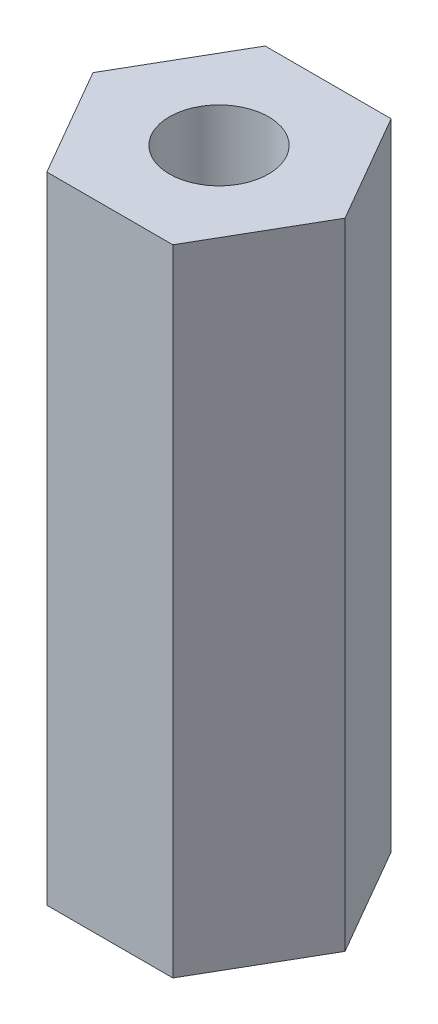
ISO-10303-21;
HEADER;
FILE_DESCRIPTION(('STEP AP214'),'2;1');
FILE_NAME('part.step','',(''),(''),'','','');
FILE_SCHEMA(('AUTOMOTIVE_DESIGN { 1 0 10303 214 1 1 1 1 }'));
ENDSEC;
DATA;
#1=APPLICATION_CONTEXT('core data for automotive mechanical design processes');
#2=APPLICATION_PROTOCOL_DEFINITION('international standard','automotive_design',2000,#1);
#3=PRODUCT_CONTEXT('',#1,'mechanical');
#4=PRODUCT('Part','Part','',(#3));
#5=PRODUCT_RELATED_PRODUCT_CATEGORY('part','',(#4));
#6=PRODUCT_DEFINITION_FORMATION('','',#4);
#7=PRODUCT_DEFINITION_CONTEXT('part definition',#1,'design');
#8=PRODUCT_DEFINITION('design','',#6,#7);
#9=PRODUCT_DEFINITION_SHAPE('','',#8);
#10=(LENGTH_UNIT() NAMED_UNIT(*) SI_UNIT(.MILLI.,.METRE.));
#11=(NAMED_UNIT(*) PLANE_ANGLE_UNIT() SI_UNIT($,.RADIAN.));
#12=(NAMED_UNIT(*) SI_UNIT($,.STERADIAN.) SOLID_ANGLE_UNIT());
#13=UNCERTAINTY_MEASURE_WITH_UNIT(LENGTH_MEASURE(1.E-05),#10,'distance_accuracy_value','');
#14=(GEOMETRIC_REPRESENTATION_CONTEXT(3) GLOBAL_UNCERTAINTY_ASSIGNED_CONTEXT((#13)) GLOBAL_UNIT_ASSIGNED_CONTEXT((#10,
#11,#12)) REPRESENTATION_CONTEXT('',''));
#15=CARTESIAN_POINT('',(0.,0.,0.));
#16=DIRECTION('',(0.,0.,1.));
#17=DIRECTION('',(1.,0.,0.));
#18=AXIS2_PLACEMENT_3D('',#15,#16,#17);
#19=CARTESIAN_POINT('',(0.,16.,0.));
#20=DIRECTION('',(0.,1.,0.));
#21=DIRECTION('',(0.,0.,1.));
#22=AXIS2_PLACEMENT_3D('',#19,#20,#21);
#23=PLANE('',#22);
#24=DIRECTION('',(0.5,0.,-0.866025403784439));
#25=VECTOR('',#24,1.);
#26=CARTESIAN_POINT('',(1.58771324027147,16.,2.75));
#27=LINE('',#26,#25);
#28=CARTESIAN_POINT('',(1.58771324027147,16.,2.75));
#29=VERTEX_POINT('',#28);
#30=CARTESIAN_POINT('',(3.17542648054294,16.,0.));
#31=VERTEX_POINT('',#30);
#32=EDGE_CURVE('E128',#29,#31,#27,.T.);
#33=ORIENTED_EDGE('',*,*,#32,.T.);
#34=DIRECTION('',(-0.5,0.,-0.866025403784438));
#35=VECTOR('',#34,1.);
#36=CARTESIAN_POINT('',(3.17542648054294,16.,0.));
#37=LINE('',#36,#35);
#38=CARTESIAN_POINT('',(1.58771324027147,16.,-2.75000000000001));
#39=VERTEX_POINT('',#38);
#40=EDGE_CURVE('E86',#31,#39,#37,.T.);
#41=ORIENTED_EDGE('',*,*,#40,.T.);
#42=DIRECTION('',(-1.,0.,0.));
#43=VECTOR('',#42,1.);
#44=CARTESIAN_POINT('',(1.58771324027147,16.,-2.75000000000001));
#45=LINE('',#44,#43);
#46=CARTESIAN_POINT('',(-1.58771324027147,16.,-2.75000000000001));
#47=VERTEX_POINT('',#46);
#48=EDGE_CURVE('E99',#39,#47,#45,.T.);
#49=ORIENTED_EDGE('',*,*,#48,.T.);
#50=DIRECTION('',(-0.5,0.,0.866025403784439));
#51=VECTOR('',#50,1.);
#52=CARTESIAN_POINT('',(-1.58771324027147,16.,-2.75000000000001));
#53=LINE('',#52,#51);
#54=CARTESIAN_POINT('',(-3.17542648054295,16.,0.));
#55=VERTEX_POINT('',#54);
#56=EDGE_CURVE('E93',#47,#55,#53,.T.);
#57=ORIENTED_EDGE('',*,*,#56,.T.);
#58=DIRECTION('',(0.5,0.,0.866025403784439));
#59=VECTOR('',#58,1.);
#60=CARTESIAN_POINT('',(-3.17542648054295,16.,0.));
#61=LINE('',#60,#59);
#62=CARTESIAN_POINT('',(-1.58771324027147,16.,2.75));
#63=VERTEX_POINT('',#62);
#64=EDGE_CURVE('E97',#55,#63,#61,.T.);
#65=ORIENTED_EDGE('',*,*,#64,.T.);
#66=DIRECTION('',(1.,0.,0.));
#67=VECTOR('',#66,1.);
#68=CARTESIAN_POINT('',(-1.58771324027147,16.,2.75));
#69=LINE('',#68,#67);
#70=EDGE_CURVE('E49',#63,#29,#69,.T.);
#71=ORIENTED_EDGE('',*,*,#70,.T.);
#72=EDGE_LOOP('',(#33,#41,#49,#57,#65,#71));
#73=FACE_BOUND('',#72,.T.);
#74=CARTESIAN_POINT('',(0.,16.,0.));
#75=DIRECTION('',(0.,1.,0.));
#76=DIRECTION('',(0.,0.,1.));
#77=AXIS2_PLACEMENT_3D('',#74,#75,#76);
#78=CIRCLE('',#77,1.25);
#79=CARTESIAN_POINT('',(0.,16.,1.25));
#80=VERTEX_POINT('',#79);
#81=EDGE_CURVE('E121',#80,#80,#78,.T.);
#82=ORIENTED_EDGE('',*,*,#81,.F.);
#83=EDGE_LOOP('',(#82));
#84=FACE_BOUND('',#83,.T.);
#85=ADVANCED_FACE('F32',(#73,#84),#23,.T.);
#86=CARTESIAN_POINT('',(0.,0.,0.));
#87=DIRECTION('',(0.,1.,0.));
#88=DIRECTION('',(0.,0.,1.));
#89=AXIS2_PLACEMENT_3D('',#86,#87,#88);
#90=PLANE('',#89);
#91=DIRECTION('',(0.5,0.,-0.866025403784439));
#92=VECTOR('',#91,1.);
#93=CARTESIAN_POINT('',(1.58771324027147,0.,2.75));
#94=LINE('',#93,#92);
#95=CARTESIAN_POINT('',(1.58771324027147,0.,2.75));
#96=VERTEX_POINT('',#95);
#97=CARTESIAN_POINT('',(3.17542648054294,0.,0.));
#98=VERTEX_POINT('',#97);
#99=EDGE_CURVE('E117',#96,#98,#94,.T.);
#100=ORIENTED_EDGE('',*,*,#99,.F.);
#101=DIRECTION('',(1.,0.,0.));
#102=VECTOR('',#101,1.);
#103=CARTESIAN_POINT('',(-1.58771324027147,0.,2.75));
#104=LINE('',#103,#102);
#105=CARTESIAN_POINT('',(-1.58771324027147,0.,2.75));
#106=VERTEX_POINT('',#105);
#107=EDGE_CURVE('E78',#106,#96,#104,.T.);
#108=ORIENTED_EDGE('',*,*,#107,.F.);
#109=DIRECTION('',(0.5,0.,0.866025403784439));
#110=VECTOR('',#109,1.);
#111=CARTESIAN_POINT('',(-3.17542648054295,0.,0.));
#112=LINE('',#111,#110);
#113=CARTESIAN_POINT('',(-3.17542648054295,0.,0.));
#114=VERTEX_POINT('',#113);
#115=EDGE_CURVE('E72',#114,#106,#112,.T.);
#116=ORIENTED_EDGE('',*,*,#115,.F.);
#117=DIRECTION('',(-0.5,0.,0.866025403784439));
#118=VECTOR('',#117,1.);
#119=CARTESIAN_POINT('',(-1.58771324027147,0.,-2.75000000000001));
#120=LINE('',#119,#118);
#121=CARTESIAN_POINT('',(-1.58771324027147,0.,-2.75000000000001));
#122=VERTEX_POINT('',#121);
#123=EDGE_CURVE('E107',#122,#114,#120,.T.);
#124=ORIENTED_EDGE('',*,*,#123,.F.);
#125=DIRECTION('',(-1.,0.,0.));
#126=VECTOR('',#125,1.);
#127=CARTESIAN_POINT('',(1.58771324027147,0.,-2.75000000000001));
#128=LINE('',#127,#126);
#129=CARTESIAN_POINT('',(1.58771324027147,0.,-2.75000000000001));
#130=VERTEX_POINT('',#129);
#131=EDGE_CURVE('E123',#130,#122,#128,.T.);
#132=ORIENTED_EDGE('',*,*,#131,.F.);
#133=DIRECTION('',(-0.5,0.,-0.866025403784438));
#134=VECTOR('',#133,1.);
#135=CARTESIAN_POINT('',(3.17542648054294,0.,0.));
#136=LINE('',#135,#134);
#137=EDGE_CURVE('E120',#98,#130,#136,.T.);
#138=ORIENTED_EDGE('',*,*,#137,.F.);
#139=EDGE_LOOP('',(#100,#108,#116,#124,#132,#138));
#140=FACE_BOUND('',#139,.T.);
#141=CARTESIAN_POINT('',(0.,0.,0.));
#142=DIRECTION('',(0.,1.,0.));
#143=DIRECTION('',(0.,0.,1.));
#144=AXIS2_PLACEMENT_3D('',#141,#142,#143);
#145=CIRCLE('',#144,1.25);
#146=CARTESIAN_POINT('',(0.,0.,1.25));
#147=VERTEX_POINT('',#146);
#148=EDGE_CURVE('E221',#147,#147,#145,.T.);
#149=ORIENTED_EDGE('',*,*,#148,.T.);
#150=EDGE_LOOP('',(#149));
#151=FACE_BOUND('',#150,.T.);
#152=ADVANCED_FACE('F137',(#140,#151),#90,.F.);
#153=CARTESIAN_POINT('',(1.58771324027147,16.,2.75));
#154=DIRECTION('',(-0.866025403784439,0.,-0.5));
#155=DIRECTION('',(-0.5,0.,0.866025403784439));
#156=AXIS2_PLACEMENT_3D('',#153,#154,#155);
#157=PLANE('',#156);
#158=ORIENTED_EDGE('',*,*,#99,.T.);
#159=DIRECTION('',(0.,-1.,0.));
#160=VECTOR('',#159,1.);
#161=CARTESIAN_POINT('',(3.17542648054294,16.,0.));
#162=LINE('',#161,#160);
#163=EDGE_CURVE('E11',#31,#98,#162,.T.);
#164=ORIENTED_EDGE('',*,*,#163,.F.);
#165=ORIENTED_EDGE('',*,*,#32,.F.);
#166=DIRECTION('',(0.,-1.,0.));
#167=VECTOR('',#166,1.);
#168=CARTESIAN_POINT('',(1.58771324027147,16.,2.75));
#169=LINE('',#168,#167);
#170=EDGE_CURVE('E113',#29,#96,#169,.T.);
#171=ORIENTED_EDGE('',*,*,#170,.T.);
#172=EDGE_LOOP('',(#158,#164,#165,#171));
#173=FACE_BOUND('',#172,.T.);
#174=ADVANCED_FACE('F34',(#173),#157,.F.);
#175=CARTESIAN_POINT('',(3.17542648054294,16.,0.));
#176=DIRECTION('',(-0.866025403784438,0.,0.5));
#177=DIRECTION('',(0.5,0.,0.866025403784439));
#178=AXIS2_PLACEMENT_3D('',#175,#176,#177);
#179=PLANE('',#178);
#180=ORIENTED_EDGE('',*,*,#137,.T.);
#181=DIRECTION('',(0.,-1.,0.));
#182=VECTOR('',#181,1.);
#183=CARTESIAN_POINT('',(1.58771324027147,16.,-2.75000000000001));
#184=LINE('',#183,#182);
#185=EDGE_CURVE('E41',#39,#130,#184,.T.);
#186=ORIENTED_EDGE('',*,*,#185,.F.);
#187=ORIENTED_EDGE('',*,*,#40,.F.);
#188=ORIENTED_EDGE('',*,*,#163,.T.);
#189=EDGE_LOOP('',(#180,#186,#187,#188));
#190=FACE_BOUND('',#189,.T.);
#191=ADVANCED_FACE('F162',(#190),#179,.F.);
#192=CARTESIAN_POINT('',(1.58771324027147,16.,-2.75000000000001));
#193=DIRECTION('',(0.,0.,1.));
#194=DIRECTION('',(1.,0.,0.));
#195=AXIS2_PLACEMENT_3D('',#192,#193,#194);
#196=PLANE('',#195);
#197=ORIENTED_EDGE('',*,*,#131,.T.);
#198=DIRECTION('',(0.,-1.,0.));
#199=VECTOR('',#198,1.);
#200=CARTESIAN_POINT('',(-1.58771324027147,16.,-2.75000000000001));
#201=LINE('',#200,#199);
#202=EDGE_CURVE('E108',#47,#122,#201,.T.);
#203=ORIENTED_EDGE('',*,*,#202,.F.);
#204=ORIENTED_EDGE('',*,*,#48,.F.);
#205=ORIENTED_EDGE('',*,*,#185,.T.);
#206=EDGE_LOOP('',(#197,#203,#204,#205));
#207=FACE_BOUND('',#206,.T.);
#208=ADVANCED_FACE('F134',(#207),#196,.F.);
#209=CARTESIAN_POINT('',(-1.58771324027147,16.,-2.75000000000001));
#210=DIRECTION('',(0.866025403784439,0.,0.5));
#211=DIRECTION('',(0.5,0.,-0.866025403784439));
#212=AXIS2_PLACEMENT_3D('',#209,#210,#211);
#213=PLANE('',#212);
#214=ORIENTED_EDGE('',*,*,#123,.T.);
#215=DIRECTION('',(0.,-1.,0.));
#216=VECTOR('',#215,1.);
#217=CARTESIAN_POINT('',(-3.17542648054295,16.,0.));
#218=LINE('',#217,#216);
#219=EDGE_CURVE('E104',#55,#114,#218,.T.);
#220=ORIENTED_EDGE('',*,*,#219,.F.);
#221=ORIENTED_EDGE('',*,*,#56,.F.);
#222=ORIENTED_EDGE('',*,*,#202,.T.);
#223=EDGE_LOOP('',(#214,#220,#221,#222));
#224=FACE_BOUND('',#223,.T.);
#225=ADVANCED_FACE('F105',(#224),#213,.F.);
#226=CARTESIAN_POINT('',(-3.17542648054295,16.,0.));
#227=DIRECTION('',(0.866025403784439,0.,-0.5));
#228=DIRECTION('',(-0.5,0.,-0.866025403784439));
#229=AXIS2_PLACEMENT_3D('',#226,#227,#228);
#230=PLANE('',#229);
#231=ORIENTED_EDGE('',*,*,#115,.T.);
#232=DIRECTION('',(0.,-1.,0.));
#233=VECTOR('',#232,1.);
#234=CARTESIAN_POINT('',(-1.58771324027147,16.,2.75));
#235=LINE('',#234,#233);
#236=EDGE_CURVE('E109',#63,#106,#235,.T.);
#237=ORIENTED_EDGE('',*,*,#236,.F.);
#238=ORIENTED_EDGE('',*,*,#64,.F.);
#239=ORIENTED_EDGE('',*,*,#219,.T.);
#240=EDGE_LOOP('',(#231,#237,#238,#239));
#241=FACE_BOUND('',#240,.T.);
#242=ADVANCED_FACE('F111',(#241),#230,.F.);
#243=CARTESIAN_POINT('',(-1.58771324027147,16.,2.75));
#244=DIRECTION('',(0.,0.,-1.));
#245=DIRECTION('',(-1.,0.,0.));
#246=AXIS2_PLACEMENT_3D('',#243,#244,#245);
#247=PLANE('',#246);
#248=ORIENTED_EDGE('',*,*,#107,.T.);
#249=ORIENTED_EDGE('',*,*,#170,.F.);
#250=ORIENTED_EDGE('',*,*,#70,.F.);
#251=ORIENTED_EDGE('',*,*,#236,.T.);
#252=EDGE_LOOP('',(#248,#249,#250,#251));
#253=FACE_BOUND('',#252,.T.);
#254=ADVANCED_FACE('F142',(#253),#247,.F.);
#255=CARTESIAN_POINT('',(0.,16.,0.));
#256=DIRECTION('',(0.,-1.,0.));
#257=DIRECTION('',(0.,0.,-1.));
#258=AXIS2_PLACEMENT_3D('',#255,#256,#257);
#259=CYLINDRICAL_SURFACE('',#258,1.25);
#260=ORIENTED_EDGE('',*,*,#81,.T.);
#261=EDGE_LOOP('',(#260));
#262=FACE_BOUND('',#261,.T.);
#263=ORIENTED_EDGE('',*,*,#148,.F.);
#264=EDGE_LOOP('',(#263));
#265=FACE_BOUND('',#264,.T.);
#266=ADVANCED_FACE('F144',(#262,#265),#259,.F.);
#267=CLOSED_SHELL('',(#85,#152,#174,#191,#208,#225,#242,#254,#266));
#268=MANIFOLD_SOLID_BREP('B2',#267);
#269=ADVANCED_BREP_SHAPE_REPRESENTATION('',(#18,#268),#14);
#270=SHAPE_DEFINITION_REPRESENTATION(#9,#269);
ENDSEC;
END-ISO-10303-21;
